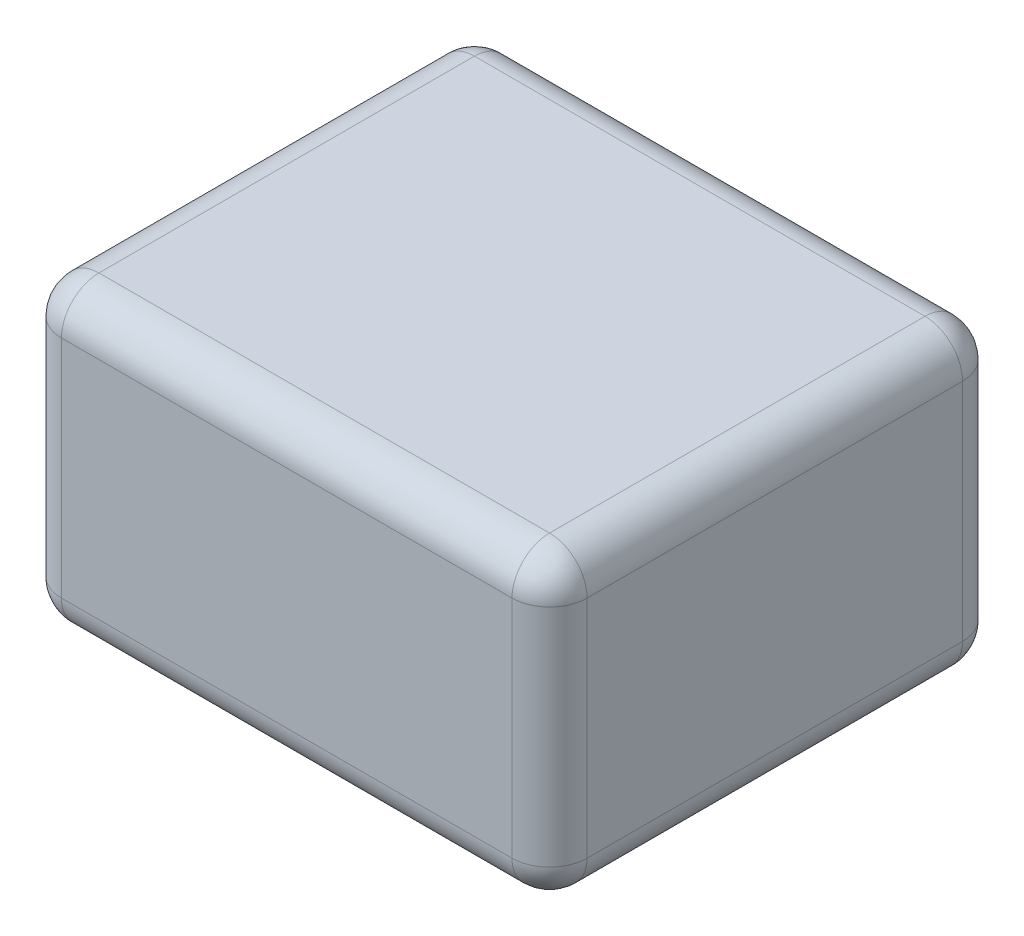
ISO-10303-21;
HEADER;
FILE_DESCRIPTION(('STEP AP214'),'2;1');
FILE_NAME('part.step','',(''),(''),'','','');
FILE_SCHEMA(('AUTOMOTIVE_DESIGN { 1 0 10303 214 1 1 1 1 }'));
ENDSEC;
DATA;
#1=APPLICATION_CONTEXT('core data for automotive mechanical design processes');
#2=APPLICATION_PROTOCOL_DEFINITION('international standard','automotive_design',2000,#1);
#3=PRODUCT_CONTEXT('',#1,'mechanical');
#4=PRODUCT('Part','Part','',(#3));
#5=PRODUCT_RELATED_PRODUCT_CATEGORY('part','',(#4));
#6=PRODUCT_DEFINITION_FORMATION('','',#4);
#7=PRODUCT_DEFINITION_CONTEXT('part definition',#1,'design');
#8=PRODUCT_DEFINITION('design','',#6,#7);
#9=PRODUCT_DEFINITION_SHAPE('','',#8);
#10=(LENGTH_UNIT() NAMED_UNIT(*) SI_UNIT(.MILLI.,.METRE.));
#11=(NAMED_UNIT(*) PLANE_ANGLE_UNIT() SI_UNIT($,.RADIAN.));
#12=(NAMED_UNIT(*) SI_UNIT($,.STERADIAN.) SOLID_ANGLE_UNIT());
#13=UNCERTAINTY_MEASURE_WITH_UNIT(LENGTH_MEASURE(1.E-05),#10,'distance_accuracy_value','');
#14=(GEOMETRIC_REPRESENTATION_CONTEXT(3) GLOBAL_UNCERTAINTY_ASSIGNED_CONTEXT((#13)) GLOBAL_UNIT_ASSIGNED_CONTEXT((#10,
#11,#12)) REPRESENTATION_CONTEXT('',''));
#15=CARTESIAN_POINT('',(0.,0.,0.));
#16=DIRECTION('',(0.,0.,1.));
#17=DIRECTION('',(1.,0.,0.));
#18=AXIS2_PLACEMENT_3D('',#15,#16,#17);
#19=CARTESIAN_POINT('',(35.,40.,-30.));
#20=DIRECTION('',(-1.,0.,0.));
#21=DIRECTION('',(0.,0.,1.));
#22=AXIS2_PLACEMENT_3D('',#19,#20,#21);
#23=PLANE('',#22);
#24=DIRECTION('',(0.,0.,-1.));
#25=VECTOR('',#24,1.);
#26=CARTESIAN_POINT('',(35.,5.,-30.));
#27=LINE('',#26,#25);
#28=CARTESIAN_POINT('',(35.,5.,25.));
#29=VERTEX_POINT('',#28);
#30=CARTESIAN_POINT('',(35.,5.,-25.));
#31=VERTEX_POINT('',#30);
#32=EDGE_CURVE('E252',#29,#31,#27,.T.);
#33=ORIENTED_EDGE('',*,*,#32,.T.);
#34=DIRECTION('',(0.,-1.,0.));
#35=VECTOR('',#34,1.);
#36=CARTESIAN_POINT('',(35.,40.,-25.));
#37=LINE('',#36,#35);
#38=CARTESIAN_POINT('',(35.,35.,-25.));
#39=VERTEX_POINT('',#38);
#40=EDGE_CURVE('E246',#31,#39,#37,.F.);
#41=ORIENTED_EDGE('',*,*,#40,.T.);
#42=DIRECTION('',(0.,0.,-1.));
#43=VECTOR('',#42,1.);
#44=CARTESIAN_POINT('',(35.,35.,30.));
#45=LINE('',#44,#43);
#46=CARTESIAN_POINT('',(35.,35.,25.));
#47=VERTEX_POINT('',#46);
#48=EDGE_CURVE('E241',#39,#47,#45,.F.);
#49=ORIENTED_EDGE('',*,*,#48,.T.);
#50=DIRECTION('',(0.,-1.,0.));
#51=VECTOR('',#50,1.);
#52=CARTESIAN_POINT('',(35.,40.,25.));
#53=LINE('',#52,#51);
#54=EDGE_CURVE('E247',#47,#29,#53,.T.);
#55=ORIENTED_EDGE('',*,*,#54,.T.);
#56=EDGE_LOOP('',(#33,#41,#49,#55));
#57=FACE_BOUND('',#56,.T.);
#58=ADVANCED_FACE('F46',(#57),#23,.F.);
#59=CARTESIAN_POINT('',(-35.,40.,-30.));
#60=DIRECTION('',(0.,0.,1.));
#61=DIRECTION('',(1.,0.,0.));
#62=AXIS2_PLACEMENT_3D('',#59,#60,#61);
#63=PLANE('',#62);
#64=DIRECTION('',(-1.,0.,0.));
#65=VECTOR('',#64,1.);
#66=CARTESIAN_POINT('',(-35.,5.,-30.));
#67=LINE('',#66,#65);
#68=CARTESIAN_POINT('',(30.,5.,-30.));
#69=VERTEX_POINT('',#68);
#70=CARTESIAN_POINT('',(-30.,5.,-30.));
#71=VERTEX_POINT('',#70);
#72=EDGE_CURVE('E334',#69,#71,#67,.T.);
#73=ORIENTED_EDGE('',*,*,#72,.T.);
#74=DIRECTION('',(0.,-1.,0.));
#75=VECTOR('',#74,1.);
#76=CARTESIAN_POINT('',(-30.,40.,-30.));
#77=LINE('',#76,#75);
#78=CARTESIAN_POINT('',(-30.,35.,-30.));
#79=VERTEX_POINT('',#78);
#80=EDGE_CURVE('E250',#71,#79,#77,.F.);
#81=ORIENTED_EDGE('',*,*,#80,.T.);
#82=DIRECTION('',(-1.,0.,0.));
#83=VECTOR('',#82,1.);
#84=CARTESIAN_POINT('',(35.,35.,-30.));
#85=LINE('',#84,#83);
#86=CARTESIAN_POINT('',(30.,35.,-30.));
#87=VERTEX_POINT('',#86);
#88=EDGE_CURVE('E322',#79,#87,#85,.F.);
#89=ORIENTED_EDGE('',*,*,#88,.T.);
#90=DIRECTION('',(0.,-1.,0.));
#91=VECTOR('',#90,1.);
#92=CARTESIAN_POINT('',(30.,40.,-30.));
#93=LINE('',#92,#91);
#94=EDGE_CURVE('E330',#87,#69,#93,.T.);
#95=ORIENTED_EDGE('',*,*,#94,.T.);
#96=EDGE_LOOP('',(#73,#81,#89,#95));
#97=FACE_BOUND('',#96,.T.);
#98=ADVANCED_FACE('F364',(#97),#63,.F.);
#99=CARTESIAN_POINT('',(-35.,40.,-30.));
#100=DIRECTION('',(1.,0.,0.));
#101=DIRECTION('',(0.,0.,-1.));
#102=AXIS2_PLACEMENT_3D('',#99,#100,#101);
#103=PLANE('',#102);
#104=DIRECTION('',(0.,-1.,0.));
#105=VECTOR('',#104,1.);
#106=CARTESIAN_POINT('',(-35.,40.,-25.));
#107=LINE('',#106,#105);
#108=CARTESIAN_POINT('',(-35.,35.,-25.));
#109=VERTEX_POINT('',#108);
#110=CARTESIAN_POINT('',(-35.,5.,-25.));
#111=VERTEX_POINT('',#110);
#112=EDGE_CURVE('E148',#109,#111,#107,.T.);
#113=ORIENTED_EDGE('',*,*,#112,.T.);
#114=DIRECTION('',(0.,0.,1.));
#115=VECTOR('',#114,1.);
#116=CARTESIAN_POINT('',(-35.,5.,-30.));
#117=LINE('',#116,#115);
#118=CARTESIAN_POINT('',(-35.,5.,25.));
#119=VERTEX_POINT('',#118);
#120=EDGE_CURVE('E143',#111,#119,#117,.T.);
#121=ORIENTED_EDGE('',*,*,#120,.T.);
#122=DIRECTION('',(0.,-1.,0.));
#123=VECTOR('',#122,1.);
#124=CARTESIAN_POINT('',(-35.,40.,25.));
#125=LINE('',#124,#123);
#126=CARTESIAN_POINT('',(-35.,35.,25.));
#127=VERTEX_POINT('',#126);
#128=EDGE_CURVE('E132',#119,#127,#125,.F.);
#129=ORIENTED_EDGE('',*,*,#128,.T.);
#130=DIRECTION('',(0.,0.,1.));
#131=VECTOR('',#130,1.);
#132=CARTESIAN_POINT('',(-35.,35.,-30.));
#133=LINE('',#132,#131);
#134=EDGE_CURVE('E138',#127,#109,#133,.F.);
#135=ORIENTED_EDGE('',*,*,#134,.T.);
#136=EDGE_LOOP('',(#113,#121,#129,#135));
#137=FACE_BOUND('',#136,.T.);
#138=ADVANCED_FACE('F140',(#137),#103,.F.);
#139=CARTESIAN_POINT('',(-35.,40.,30.));
#140=DIRECTION('',(0.,0.,-1.));
#141=DIRECTION('',(-1.,0.,0.));
#142=AXIS2_PLACEMENT_3D('',#139,#140,#141);
#143=PLANE('',#142);
#144=DIRECTION('',(0.,-1.,0.));
#145=VECTOR('',#144,1.);
#146=CARTESIAN_POINT('',(-30.,40.,30.));
#147=LINE('',#146,#145);
#148=CARTESIAN_POINT('',(-30.,35.,30.));
#149=VERTEX_POINT('',#148);
#150=CARTESIAN_POINT('',(-30.,5.,30.));
#151=VERTEX_POINT('',#150);
#152=EDGE_CURVE('E168',#149,#151,#147,.T.);
#153=ORIENTED_EDGE('',*,*,#152,.T.);
#154=DIRECTION('',(1.,0.,0.));
#155=VECTOR('',#154,1.);
#156=CARTESIAN_POINT('',(-35.,5.,30.));
#157=LINE('',#156,#155);
#158=CARTESIAN_POINT('',(30.,5.,30.));
#159=VERTEX_POINT('',#158);
#160=EDGE_CURVE('E269',#151,#159,#157,.T.);
#161=ORIENTED_EDGE('',*,*,#160,.T.);
#162=DIRECTION('',(0.,-1.,0.));
#163=VECTOR('',#162,1.);
#164=CARTESIAN_POINT('',(30.,40.,30.));
#165=LINE('',#164,#163);
#166=CARTESIAN_POINT('',(30.,35.,30.));
#167=VERTEX_POINT('',#166);
#168=EDGE_CURVE('E261',#159,#167,#165,.F.);
#169=ORIENTED_EDGE('',*,*,#168,.T.);
#170=DIRECTION('',(1.,0.,0.));
#171=VECTOR('',#170,1.);
#172=CARTESIAN_POINT('',(-35.,35.,30.));
#173=LINE('',#172,#171);
#174=EDGE_CURVE('E260',#167,#149,#173,.F.);
#175=ORIENTED_EDGE('',*,*,#174,.T.);
#176=EDGE_LOOP('',(#153,#161,#169,#175));
#177=FACE_BOUND('',#176,.T.);
#178=ADVANCED_FACE('F548',(#177),#143,.F.);
#179=CARTESIAN_POINT('',(0.,40.,0.));
#180=DIRECTION('',(0.,1.,0.));
#181=DIRECTION('',(0.,0.,1.));
#182=AXIS2_PLACEMENT_3D('',#179,#180,#181);
#183=PLANE('',#182);
#184=DIRECTION('',(0.,0.,1.));
#185=VECTOR('',#184,1.);
#186=CARTESIAN_POINT('',(-30.,40.,30.));
#187=LINE('',#186,#185);
#188=CARTESIAN_POINT('',(-30.,40.,-25.));
#189=VERTEX_POINT('',#188);
#190=CARTESIAN_POINT('',(-30.,40.,25.));
#191=VERTEX_POINT('',#190);
#192=EDGE_CURVE('E57',#189,#191,#187,.T.);
#193=ORIENTED_EDGE('',*,*,#192,.T.);
#194=DIRECTION('',(1.,0.,0.));
#195=VECTOR('',#194,1.);
#196=CARTESIAN_POINT('',(35.,40.,25.));
#197=LINE('',#196,#195);
#198=CARTESIAN_POINT('',(30.,40.,25.));
#199=VERTEX_POINT('',#198);
#200=EDGE_CURVE('E11',#191,#199,#197,.T.);
#201=ORIENTED_EDGE('',*,*,#200,.T.);
#202=DIRECTION('',(0.,0.,-1.));
#203=VECTOR('',#202,1.);
#204=CARTESIAN_POINT('',(30.,40.,-30.));
#205=LINE('',#204,#203);
#206=CARTESIAN_POINT('',(30.,40.,-25.));
#207=VERTEX_POINT('',#206);
#208=EDGE_CURVE('E272',#199,#207,#205,.T.);
#209=ORIENTED_EDGE('',*,*,#208,.T.);
#210=DIRECTION('',(-1.,0.,0.));
#211=VECTOR('',#210,1.);
#212=CARTESIAN_POINT('',(-35.,40.,-25.));
#213=LINE('',#212,#211);
#214=EDGE_CURVE('E70',#207,#189,#213,.T.);
#215=ORIENTED_EDGE('',*,*,#214,.T.);
#216=EDGE_LOOP('',(#193,#201,#209,#215));
#217=FACE_BOUND('',#216,.T.);
#218=ADVANCED_FACE('F541',(#217),#183,.T.);
#219=CARTESIAN_POINT('',(0.,0.,0.));
#220=DIRECTION('',(0.,1.,0.));
#221=DIRECTION('',(0.,0.,1.));
#222=AXIS2_PLACEMENT_3D('',#219,#220,#221);
#223=PLANE('',#222);
#224=DIRECTION('',(1.,0.,0.));
#225=VECTOR('',#224,1.);
#226=CARTESIAN_POINT('',(0.,0.,25.));
#227=LINE('',#226,#225);
#228=CARTESIAN_POINT('',(30.,0.,25.));
#229=VERTEX_POINT('',#228);
#230=CARTESIAN_POINT('',(-30.,0.,25.));
#231=VERTEX_POINT('',#230);
#232=EDGE_CURVE('E317',#229,#231,#227,.F.);
#233=ORIENTED_EDGE('',*,*,#232,.T.);
#234=DIRECTION('',(0.,0.,1.));
#235=VECTOR('',#234,1.);
#236=CARTESIAN_POINT('',(-30.,0.,0.));
#237=LINE('',#236,#235);
#238=CARTESIAN_POINT('',(-30.,0.,-25.));
#239=VERTEX_POINT('',#238);
#240=EDGE_CURVE('E311',#231,#239,#237,.F.);
#241=ORIENTED_EDGE('',*,*,#240,.T.);
#242=DIRECTION('',(-1.,0.,0.));
#243=VECTOR('',#242,1.);
#244=CARTESIAN_POINT('',(0.,0.,-25.));
#245=LINE('',#244,#243);
#246=CARTESIAN_POINT('',(30.,0.,-25.));
#247=VERTEX_POINT('',#246);
#248=EDGE_CURVE('E308',#239,#247,#245,.F.);
#249=ORIENTED_EDGE('',*,*,#248,.T.);
#250=DIRECTION('',(0.,0.,-1.));
#251=VECTOR('',#250,1.);
#252=CARTESIAN_POINT('',(30.,0.,0.));
#253=LINE('',#252,#251);
#254=EDGE_CURVE('E314',#247,#229,#253,.F.);
#255=ORIENTED_EDGE('',*,*,#254,.T.);
#256=EDGE_LOOP('',(#233,#241,#249,#255));
#257=FACE_BOUND('',#256,.T.);
#258=ADVANCED_FACE('F320',(#257),#223,.F.);
#259=CARTESIAN_POINT('',(30.,35.,0.));
#260=DIRECTION('',(0.,0.,1.));
#261=DIRECTION('',(1.,0.,0.));
#262=AXIS2_PLACEMENT_3D('',#259,#260,#261);
#263=CYLINDRICAL_SURFACE('',#262,5.);
#264=CARTESIAN_POINT('',(30.,35.,-25.));
#265=DIRECTION('',(0.,0.,-1.));
#266=DIRECTION('',(-1.,0.,0.));
#267=AXIS2_PLACEMENT_3D('',#264,#265,#266);
#268=CIRCLE('',#267,5.);
#269=EDGE_CURVE('E49',#207,#39,#268,.T.);
#270=ORIENTED_EDGE('',*,*,#269,.F.);
#271=ORIENTED_EDGE('',*,*,#208,.F.);
#272=CARTESIAN_POINT('',(30.,35.,25.));
#273=DIRECTION('',(0.,0.,1.));
#274=DIRECTION('',(1.,0.,0.));
#275=AXIS2_PLACEMENT_3D('',#272,#273,#274);
#276=CIRCLE('',#275,5.);
#277=EDGE_CURVE('E221',#47,#199,#276,.T.);
#278=ORIENTED_EDGE('',*,*,#277,.F.);
#279=ORIENTED_EDGE('',*,*,#48,.F.);
#280=EDGE_LOOP('',(#270,#271,#278,#279));
#281=FACE_BOUND('',#280,.T.);
#282=ADVANCED_FACE('F48',(#281),#263,.T.);
#283=CARTESIAN_POINT('',(30.,35.,-25.));
#284=DIRECTION('',(1.,0.,0.));
#285=DIRECTION('',(0.,0.,-1.));
#286=AXIS2_PLACEMENT_3D('',#283,#284,#285);
#287=SPHERICAL_SURFACE('',#286,5.);
#288=CARTESIAN_POINT('',(30.,35.,-25.));
#289=DIRECTION('',(1.,0.,0.));
#290=DIRECTION('',(0.,1.,0.));
#291=AXIS2_PLACEMENT_3D('',#288,#289,#290);
#292=CIRCLE('',#291,5.);
#293=EDGE_CURVE('E217',#207,#87,#292,.F.);
#294=ORIENTED_EDGE('',*,*,#293,.F.);
#295=ORIENTED_EDGE('',*,*,#269,.T.);
#296=CARTESIAN_POINT('',(30.,35.,-25.));
#297=DIRECTION('',(0.,1.,0.));
#298=DIRECTION('',(0.,0.,1.));
#299=AXIS2_PLACEMENT_3D('',#296,#297,#298);
#300=CIRCLE('',#299,5.);
#301=EDGE_CURVE('E225',#87,#39,#300,.F.);
#302=ORIENTED_EDGE('',*,*,#301,.F.);
#303=EDGE_LOOP('',(#294,#295,#302));
#304=FACE_BOUND('',#303,.T.);
#305=ADVANCED_FACE('F239',(#304),#287,.T.);
#306=CARTESIAN_POINT('',(30.,35.,25.));
#307=DIRECTION('',(0.,1.,0.));
#308=DIRECTION('',(0.,0.,1.));
#309=AXIS2_PLACEMENT_3D('',#306,#307,#308);
#310=SPHERICAL_SURFACE('',#309,5.);
#311=CARTESIAN_POINT('',(30.,35.,25.));
#312=DIRECTION('',(0.,1.,0.));
#313=DIRECTION('',(0.,0.,1.));
#314=AXIS2_PLACEMENT_3D('',#311,#312,#313);
#315=CIRCLE('',#314,5.);
#316=EDGE_CURVE('E211',#47,#167,#315,.F.);
#317=ORIENTED_EDGE('',*,*,#316,.F.);
#318=ORIENTED_EDGE('',*,*,#277,.T.);
#319=CARTESIAN_POINT('',(30.,35.,25.));
#320=DIRECTION('',(1.,0.,0.));
#321=DIRECTION('',(0.,0.,-1.));
#322=AXIS2_PLACEMENT_3D('',#319,#320,#321);
#323=CIRCLE('',#322,5.);
#324=EDGE_CURVE('E214',#167,#199,#323,.F.);
#325=ORIENTED_EDGE('',*,*,#324,.F.);
#326=EDGE_LOOP('',(#317,#318,#325));
#327=FACE_BOUND('',#326,.T.);
#328=ADVANCED_FACE('F514',(#327),#310,.T.);
#329=CARTESIAN_POINT('',(30.,40.,-25.));
#330=DIRECTION('',(0.,-1.,0.));
#331=DIRECTION('',(0.,0.,-1.));
#332=AXIS2_PLACEMENT_3D('',#329,#330,#331);
#333=CYLINDRICAL_SURFACE('',#332,5.);
#334=ORIENTED_EDGE('',*,*,#301,.T.);
#335=ORIENTED_EDGE('',*,*,#40,.F.);
#336=CARTESIAN_POINT('',(30.,5.,-25.));
#337=DIRECTION('',(0.,-1.,0.));
#338=DIRECTION('',(0.,0.,-1.));
#339=AXIS2_PLACEMENT_3D('',#336,#337,#338);
#340=CIRCLE('',#339,5.);
#341=EDGE_CURVE('E201',#69,#31,#340,.T.);
#342=ORIENTED_EDGE('',*,*,#341,.F.);
#343=ORIENTED_EDGE('',*,*,#94,.F.);
#344=EDGE_LOOP('',(#334,#335,#342,#343));
#345=FACE_BOUND('',#344,.T.);
#346=ADVANCED_FACE('F370',(#345),#333,.T.);
#347=CARTESIAN_POINT('',(0.,35.,-25.));
#348=DIRECTION('',(1.,0.,0.));
#349=DIRECTION('',(0.,0.,-1.));
#350=AXIS2_PLACEMENT_3D('',#347,#348,#349);
#351=CYLINDRICAL_SURFACE('',#350,5.);
#352=ORIENTED_EDGE('',*,*,#293,.T.);
#353=ORIENTED_EDGE('',*,*,#88,.F.);
#354=CARTESIAN_POINT('',(-30.,35.,-25.));
#355=DIRECTION('',(-1.,0.,0.));
#356=DIRECTION('',(0.,0.,1.));
#357=AXIS2_PLACEMENT_3D('',#354,#355,#356);
#358=CIRCLE('',#357,5.);
#359=EDGE_CURVE('E200',#189,#79,#358,.T.);
#360=ORIENTED_EDGE('',*,*,#359,.F.);
#361=ORIENTED_EDGE('',*,*,#214,.F.);
#362=EDGE_LOOP('',(#352,#353,#360,#361));
#363=FACE_BOUND('',#362,.T.);
#364=ADVANCED_FACE('F499',(#363),#351,.T.);
#365=CARTESIAN_POINT('',(-30.,35.,0.));
#366=DIRECTION('',(0.,0.,-1.));
#367=DIRECTION('',(-1.,0.,0.));
#368=AXIS2_PLACEMENT_3D('',#365,#366,#367);
#369=CYLINDRICAL_SURFACE('',#368,5.);
#370=CARTESIAN_POINT('',(-30.,35.,25.));
#371=DIRECTION('',(0.,0.,1.));
#372=DIRECTION('',(1.,0.,0.));
#373=AXIS2_PLACEMENT_3D('',#370,#371,#372);
#374=CIRCLE('',#373,5.);
#375=EDGE_CURVE('E155',#191,#127,#374,.T.);
#376=ORIENTED_EDGE('',*,*,#375,.F.);
#377=ORIENTED_EDGE('',*,*,#192,.F.);
#378=CARTESIAN_POINT('',(-30.,35.,-25.));
#379=DIRECTION('',(0.,0.,-1.));
#380=DIRECTION('',(-1.,0.,0.));
#381=AXIS2_PLACEMENT_3D('',#378,#379,#380);
#382=CIRCLE('',#381,5.);
#383=EDGE_CURVE('E154',#109,#189,#382,.T.);
#384=ORIENTED_EDGE('',*,*,#383,.F.);
#385=ORIENTED_EDGE('',*,*,#134,.F.);
#386=EDGE_LOOP('',(#376,#377,#384,#385));
#387=FACE_BOUND('',#386,.T.);
#388=ADVANCED_FACE('F151',(#387),#369,.T.);
#389=CARTESIAN_POINT('',(0.,35.,25.));
#390=DIRECTION('',(-1.,0.,0.));
#391=DIRECTION('',(0.,0.,1.));
#392=AXIS2_PLACEMENT_3D('',#389,#390,#391);
#393=CYLINDRICAL_SURFACE('',#392,5.);
#394=ORIENTED_EDGE('',*,*,#324,.T.);
#395=ORIENTED_EDGE('',*,*,#200,.F.);
#396=CARTESIAN_POINT('',(-30.,35.,25.));
#397=DIRECTION('',(-1.,0.,0.));
#398=DIRECTION('',(0.,0.,1.));
#399=AXIS2_PLACEMENT_3D('',#396,#397,#398);
#400=CIRCLE('',#399,5.);
#401=EDGE_CURVE('E164',#149,#191,#400,.T.);
#402=ORIENTED_EDGE('',*,*,#401,.F.);
#403=ORIENTED_EDGE('',*,*,#174,.F.);
#404=EDGE_LOOP('',(#394,#395,#402,#403));
#405=FACE_BOUND('',#404,.T.);
#406=ADVANCED_FACE('F485',(#405),#393,.T.);
#407=CARTESIAN_POINT('',(30.,40.,25.));
#408=DIRECTION('',(0.,-1.,0.));
#409=DIRECTION('',(0.,0.,-1.));
#410=AXIS2_PLACEMENT_3D('',#407,#408,#409);
#411=CYLINDRICAL_SURFACE('',#410,5.);
#412=ORIENTED_EDGE('',*,*,#316,.T.);
#413=ORIENTED_EDGE('',*,*,#168,.F.);
#414=CARTESIAN_POINT('',(30.,5.,25.));
#415=DIRECTION('',(0.,-1.,0.));
#416=DIRECTION('',(0.,0.,-1.));
#417=AXIS2_PLACEMENT_3D('',#414,#415,#416);
#418=CIRCLE('',#417,5.);
#419=EDGE_CURVE('E192',#29,#159,#418,.T.);
#420=ORIENTED_EDGE('',*,*,#419,.F.);
#421=ORIENTED_EDGE('',*,*,#54,.F.);
#422=EDGE_LOOP('',(#412,#413,#420,#421));
#423=FACE_BOUND('',#422,.T.);
#424=ADVANCED_FACE('F350',(#423),#411,.T.);
#425=CARTESIAN_POINT('',(30.,5.,-30.));
#426=DIRECTION('',(0.,0.,-1.));
#427=DIRECTION('',(-1.,0.,0.));
#428=AXIS2_PLACEMENT_3D('',#425,#426,#427);
#429=CYLINDRICAL_SURFACE('',#428,5.);
#430=CARTESIAN_POINT('',(30.,5.,-25.));
#431=DIRECTION('',(0.,0.,-1.));
#432=DIRECTION('',(-1.,0.,0.));
#433=AXIS2_PLACEMENT_3D('',#430,#431,#432);
#434=CIRCLE('',#433,5.);
#435=EDGE_CURVE('E210',#31,#247,#434,.T.);
#436=ORIENTED_EDGE('',*,*,#435,.F.);
#437=ORIENTED_EDGE('',*,*,#32,.F.);
#438=CARTESIAN_POINT('',(30.,5.,25.));
#439=DIRECTION('',(0.,0.,1.));
#440=DIRECTION('',(1.,0.,0.));
#441=AXIS2_PLACEMENT_3D('',#438,#439,#440);
#442=CIRCLE('',#441,5.);
#443=EDGE_CURVE('E186',#229,#29,#442,.T.);
#444=ORIENTED_EDGE('',*,*,#443,.F.);
#445=ORIENTED_EDGE('',*,*,#254,.F.);
#446=EDGE_LOOP('',(#436,#437,#444,#445));
#447=FACE_BOUND('',#446,.T.);
#448=ADVANCED_FACE('F344',(#447),#429,.T.);
#449=CARTESIAN_POINT('',(30.,5.,-25.));
#450=DIRECTION('',(1.,0.,0.));
#451=DIRECTION('',(0.,1.,0.));
#452=AXIS2_PLACEMENT_3D('',#449,#450,#451);
#453=SPHERICAL_SURFACE('',#452,5.);
#454=ORIENTED_EDGE('',*,*,#341,.T.);
#455=ORIENTED_EDGE('',*,*,#435,.T.);
#456=CARTESIAN_POINT('',(30.,5.,-25.));
#457=DIRECTION('',(1.,0.,0.));
#458=DIRECTION('',(0.,0.,-1.));
#459=AXIS2_PLACEMENT_3D('',#456,#457,#458);
#460=CIRCLE('',#459,5.);
#461=EDGE_CURVE('E180',#69,#247,#460,.F.);
#462=ORIENTED_EDGE('',*,*,#461,.F.);
#463=EDGE_LOOP('',(#454,#455,#462));
#464=FACE_BOUND('',#463,.T.);
#465=ADVANCED_FACE('F369',(#464),#453,.T.);
#466=CARTESIAN_POINT('',(-30.,35.,-25.));
#467=DIRECTION('',(0.,1.,0.));
#468=DIRECTION('',(0.,0.,1.));
#469=AXIS2_PLACEMENT_3D('',#466,#467,#468);
#470=SPHERICAL_SURFACE('',#469,5.);
#471=ORIENTED_EDGE('',*,*,#383,.T.);
#472=ORIENTED_EDGE('',*,*,#359,.T.);
#473=CARTESIAN_POINT('',(-30.,35.,-25.));
#474=DIRECTION('',(0.,1.,0.));
#475=DIRECTION('',(0.,0.,1.));
#476=AXIS2_PLACEMENT_3D('',#473,#474,#475);
#477=CIRCLE('',#476,5.);
#478=EDGE_CURVE('E171',#109,#79,#477,.F.);
#479=ORIENTED_EDGE('',*,*,#478,.F.);
#480=EDGE_LOOP('',(#471,#472,#479));
#481=FACE_BOUND('',#480,.T.);
#482=ADVANCED_FACE('F371',(#481),#470,.T.);
#483=CARTESIAN_POINT('',(-30.,35.,25.));
#484=DIRECTION('',(0.,1.,0.));
#485=DIRECTION('',(0.,0.,1.));
#486=AXIS2_PLACEMENT_3D('',#483,#484,#485);
#487=SPHERICAL_SURFACE('',#486,5.);
#488=ORIENTED_EDGE('',*,*,#401,.T.);
#489=ORIENTED_EDGE('',*,*,#375,.T.);
#490=CARTESIAN_POINT('',(-30.,35.,25.));
#491=DIRECTION('',(0.,1.,0.));
#492=DIRECTION('',(0.,0.,1.));
#493=AXIS2_PLACEMENT_3D('',#490,#491,#492);
#494=CIRCLE('',#493,5.);
#495=EDGE_CURVE('E165',#149,#127,#494,.F.);
#496=ORIENTED_EDGE('',*,*,#495,.F.);
#497=EDGE_LOOP('',(#488,#489,#496));
#498=FACE_BOUND('',#497,.T.);
#499=ADVANCED_FACE('F161',(#498),#487,.T.);
#500=CARTESIAN_POINT('',(30.,5.,25.));
#501=DIRECTION('',(1.,0.,0.));
#502=DIRECTION('',(0.,1.,0.));
#503=AXIS2_PLACEMENT_3D('',#500,#501,#502);
#504=SPHERICAL_SURFACE('',#503,5.);
#505=ORIENTED_EDGE('',*,*,#443,.T.);
#506=ORIENTED_EDGE('',*,*,#419,.T.);
#507=CARTESIAN_POINT('',(30.,5.,25.));
#508=DIRECTION('',(1.,0.,0.));
#509=DIRECTION('',(0.,0.,-1.));
#510=AXIS2_PLACEMENT_3D('',#507,#508,#509);
#511=CIRCLE('',#510,5.);
#512=EDGE_CURVE('E175',#229,#159,#511,.F.);
#513=ORIENTED_EDGE('',*,*,#512,.F.);
#514=EDGE_LOOP('',(#505,#506,#513));
#515=FACE_BOUND('',#514,.T.);
#516=ADVANCED_FACE('F349',(#515),#504,.T.);
#517=CARTESIAN_POINT('',(-35.,5.,-25.));
#518=DIRECTION('',(-1.,0.,0.));
#519=DIRECTION('',(0.,0.,1.));
#520=AXIS2_PLACEMENT_3D('',#517,#518,#519);
#521=CYLINDRICAL_SURFACE('',#520,5.);
#522=ORIENTED_EDGE('',*,*,#461,.T.);
#523=ORIENTED_EDGE('',*,*,#248,.F.);
#524=CARTESIAN_POINT('',(-30.,5.,-25.));
#525=DIRECTION('',(-1.,0.,0.));
#526=DIRECTION('',(0.,0.,1.));
#527=AXIS2_PLACEMENT_3D('',#524,#525,#526);
#528=CIRCLE('',#527,5.);
#529=EDGE_CURVE('E176',#71,#239,#528,.T.);
#530=ORIENTED_EDGE('',*,*,#529,.F.);
#531=ORIENTED_EDGE('',*,*,#72,.F.);
#532=EDGE_LOOP('',(#522,#523,#530,#531));
#533=FACE_BOUND('',#532,.T.);
#534=ADVANCED_FACE('F306',(#533),#521,.T.);
#535=CARTESIAN_POINT('',(-30.,40.,-25.));
#536=DIRECTION('',(0.,-1.,0.));
#537=DIRECTION('',(0.,0.,-1.));
#538=AXIS2_PLACEMENT_3D('',#535,#536,#537);
#539=CYLINDRICAL_SURFACE('',#538,5.);
#540=ORIENTED_EDGE('',*,*,#478,.T.);
#541=ORIENTED_EDGE('',*,*,#80,.F.);
#542=CARTESIAN_POINT('',(-30.,5.,-25.));
#543=DIRECTION('',(0.,-1.,0.));
#544=DIRECTION('',(0.,0.,-1.));
#545=AXIS2_PLACEMENT_3D('',#542,#543,#544);
#546=CIRCLE('',#545,5.);
#547=EDGE_CURVE('E291',#111,#71,#546,.T.);
#548=ORIENTED_EDGE('',*,*,#547,.F.);
#549=ORIENTED_EDGE('',*,*,#112,.F.);
#550=EDGE_LOOP('',(#540,#541,#548,#549));
#551=FACE_BOUND('',#550,.T.);
#552=ADVANCED_FACE('F361',(#551),#539,.T.);
#553=CARTESIAN_POINT('',(-30.,40.,25.));
#554=DIRECTION('',(0.,-1.,0.));
#555=DIRECTION('',(0.,0.,-1.));
#556=AXIS2_PLACEMENT_3D('',#553,#554,#555);
#557=CYLINDRICAL_SURFACE('',#556,5.);
#558=ORIENTED_EDGE('',*,*,#495,.T.);
#559=ORIENTED_EDGE('',*,*,#128,.F.);
#560=CARTESIAN_POINT('',(-30.,5.,25.));
#561=DIRECTION('',(0.,-1.,0.));
#562=DIRECTION('',(0.,0.,-1.));
#563=AXIS2_PLACEMENT_3D('',#560,#561,#562);
#564=CIRCLE('',#563,5.);
#565=EDGE_CURVE('E289',#151,#119,#564,.T.);
#566=ORIENTED_EDGE('',*,*,#565,.F.);
#567=ORIENTED_EDGE('',*,*,#152,.F.);
#568=EDGE_LOOP('',(#558,#559,#566,#567));
#569=FACE_BOUND('',#568,.T.);
#570=ADVANCED_FACE('F169',(#569),#557,.T.);
#571=CARTESIAN_POINT('',(-35.,5.,25.));
#572=DIRECTION('',(1.,0.,0.));
#573=DIRECTION('',(0.,0.,-1.));
#574=AXIS2_PLACEMENT_3D('',#571,#572,#573);
#575=CYLINDRICAL_SURFACE('',#574,5.);
#576=ORIENTED_EDGE('',*,*,#512,.T.);
#577=ORIENTED_EDGE('',*,*,#160,.F.);
#578=CARTESIAN_POINT('',(-30.,5.,25.));
#579=DIRECTION('',(-1.,0.,0.));
#580=DIRECTION('',(0.,0.,1.));
#581=AXIS2_PLACEMENT_3D('',#578,#579,#580);
#582=CIRCLE('',#581,5.);
#583=EDGE_CURVE('E287',#231,#151,#582,.T.);
#584=ORIENTED_EDGE('',*,*,#583,.F.);
#585=ORIENTED_EDGE('',*,*,#232,.F.);
#586=EDGE_LOOP('',(#576,#577,#584,#585));
#587=FACE_BOUND('',#586,.T.);
#588=ADVANCED_FACE('F351',(#587),#575,.T.);
#589=CARTESIAN_POINT('',(-30.,5.,-25.));
#590=DIRECTION('',(0.,0.,-1.));
#591=DIRECTION('',(0.,1.,0.));
#592=AXIS2_PLACEMENT_3D('',#589,#590,#591);
#593=SPHERICAL_SURFACE('',#592,5.);
#594=ORIENTED_EDGE('',*,*,#547,.T.);
#595=ORIENTED_EDGE('',*,*,#529,.T.);
#596=CARTESIAN_POINT('',(-30.,5.,-25.));
#597=DIRECTION('',(0.,0.,-1.));
#598=DIRECTION('',(-1.,0.,0.));
#599=AXIS2_PLACEMENT_3D('',#596,#597,#598);
#600=CIRCLE('',#599,5.);
#601=EDGE_CURVE('E285',#111,#239,#600,.F.);
#602=ORIENTED_EDGE('',*,*,#601,.F.);
#603=EDGE_LOOP('',(#594,#595,#602));
#604=FACE_BOUND('',#603,.T.);
#605=ADVANCED_FACE('F305',(#604),#593,.T.);
#606=CARTESIAN_POINT('',(-30.,5.,25.));
#607=DIRECTION('',(0.,0.,1.));
#608=DIRECTION('',(0.,-1.,0.));
#609=AXIS2_PLACEMENT_3D('',#606,#607,#608);
#610=SPHERICAL_SURFACE('',#609,5.);
#611=ORIENTED_EDGE('',*,*,#583,.T.);
#612=ORIENTED_EDGE('',*,*,#565,.T.);
#613=CARTESIAN_POINT('',(-30.,5.,25.));
#614=DIRECTION('',(0.,0.,1.));
#615=DIRECTION('',(1.,0.,0.));
#616=AXIS2_PLACEMENT_3D('',#613,#614,#615);
#617=CIRCLE('',#616,5.);
#618=EDGE_CURVE('E278',#231,#119,#617,.F.);
#619=ORIENTED_EDGE('',*,*,#618,.F.);
#620=EDGE_LOOP('',(#611,#612,#619));
#621=FACE_BOUND('',#620,.T.);
#622=ADVANCED_FACE('F394',(#621),#610,.T.);
#623=CARTESIAN_POINT('',(-30.,5.,-30.));
#624=DIRECTION('',(0.,0.,1.));
#625=DIRECTION('',(1.,0.,0.));
#626=AXIS2_PLACEMENT_3D('',#623,#624,#625);
#627=CYLINDRICAL_SURFACE('',#626,5.);
#628=ORIENTED_EDGE('',*,*,#601,.T.);
#629=ORIENTED_EDGE('',*,*,#240,.F.);
#630=ORIENTED_EDGE('',*,*,#618,.T.);
#631=ORIENTED_EDGE('',*,*,#120,.F.);
#632=EDGE_LOOP('',(#628,#629,#630,#631));
#633=FACE_BOUND('',#632,.T.);
#634=ADVANCED_FACE('F389',(#633),#627,.T.);
#635=CLOSED_SHELL('',(#58,#98,#138,#178,#218,#258,#282,#305,#328,#346,#364,#388,#406,#424,#448,
#465,#482,#499,#516,#534,#552,#570,#588,#605,#622,#634));
#636=MANIFOLD_SOLID_BREP('B2',#635);
#637=ADVANCED_BREP_SHAPE_REPRESENTATION('',(#18,#636),#14);
#638=SHAPE_DEFINITION_REPRESENTATION(#9,#637);
ENDSEC;
END-ISO-10303-21;
